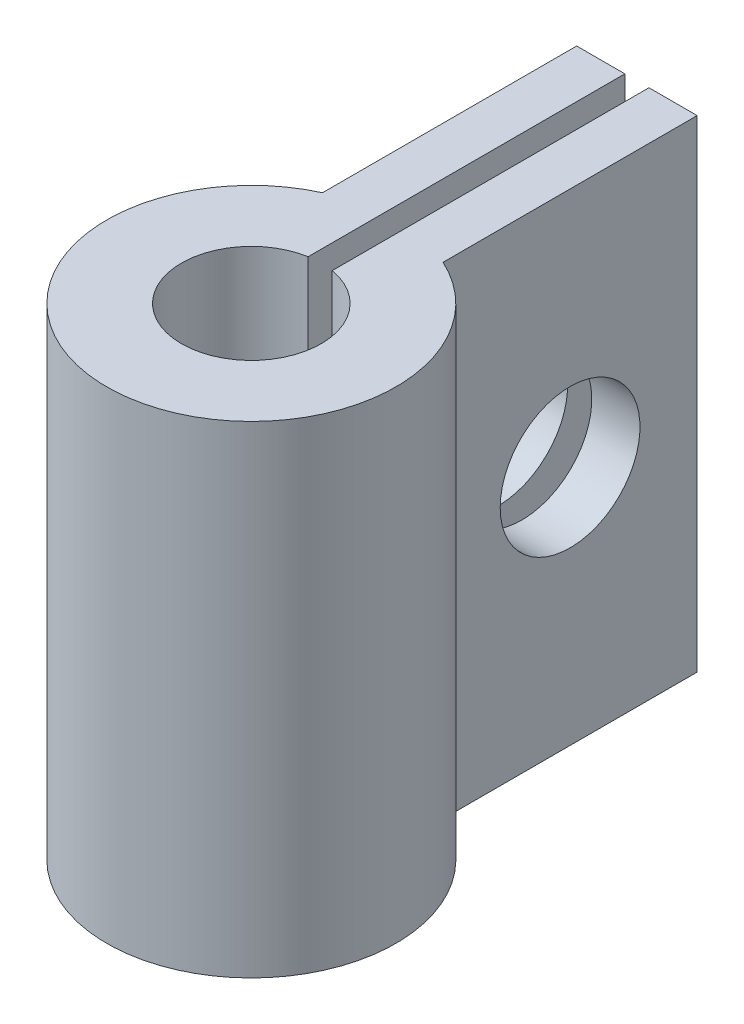
ISO-10303-21;
HEADER;
FILE_DESCRIPTION(('STEP AP214'),'2;1');
FILE_NAME('part.step','',(''),(''),'','','');
FILE_SCHEMA(('AUTOMOTIVE_DESIGN { 1 0 10303 214 1 1 1 1 }'));
ENDSEC;
DATA;
#1=APPLICATION_CONTEXT('core data for automotive mechanical design processes');
#2=APPLICATION_PROTOCOL_DEFINITION('international standard','automotive_design',2000,#1);
#3=PRODUCT_CONTEXT('',#1,'mechanical');
#4=PRODUCT('Part','Part','',(#3));
#5=PRODUCT_RELATED_PRODUCT_CATEGORY('part','',(#4));
#6=PRODUCT_DEFINITION_FORMATION('','',#4);
#7=PRODUCT_DEFINITION_CONTEXT('part definition',#1,'design');
#8=PRODUCT_DEFINITION('design','',#6,#7);
#9=PRODUCT_DEFINITION_SHAPE('','',#8);
#10=(LENGTH_UNIT() NAMED_UNIT(*) SI_UNIT(.MILLI.,.METRE.));
#11=(NAMED_UNIT(*) PLANE_ANGLE_UNIT() SI_UNIT($,.RADIAN.));
#12=(NAMED_UNIT(*) SI_UNIT($,.STERADIAN.) SOLID_ANGLE_UNIT());
#13=UNCERTAINTY_MEASURE_WITH_UNIT(LENGTH_MEASURE(1.E-05),#10,'distance_accuracy_value','');
#14=(GEOMETRIC_REPRESENTATION_CONTEXT(3) GLOBAL_UNCERTAINTY_ASSIGNED_CONTEXT((#13)) GLOBAL_UNIT_ASSIGNED_CONTEXT((#10,
#11,#12)) REPRESENTATION_CONTEXT('',''));
#15=CARTESIAN_POINT('',(0.,0.,0.));
#16=DIRECTION('',(0.,0.,1.));
#17=DIRECTION('',(1.,0.,0.));
#18=AXIS2_PLACEMENT_3D('',#15,#16,#17);
#19=CARTESIAN_POINT('',(0.,20.,0.));
#20=DIRECTION('',(0.,-1.,0.));
#21=DIRECTION('',(0.,0.,-1.));
#22=AXIS2_PLACEMENT_3D('',#19,#20,#21);
#23=CYLINDRICAL_SURFACE('',#22,6.);
#24=DIRECTION('',(0.,-1.,0.));
#25=VECTOR('',#24,1.);
#26=CARTESIAN_POINT('',(2.5,20.,-5.45435605731786));
#27=LINE('',#26,#25);
#28=CARTESIAN_POINT('',(2.5,20.,-5.45435605731786));
#29=VERTEX_POINT('',#28);
#30=CARTESIAN_POINT('',(2.5,0.,-5.45435605731786));
#31=VERTEX_POINT('',#30);
#32=EDGE_CURVE('E131',#29,#31,#27,.T.);
#33=ORIENTED_EDGE('',*,*,#32,.F.);
#34=CARTESIAN_POINT('',(0.,20.,0.));
#35=DIRECTION('',(0.,1.,0.));
#36=DIRECTION('',(0.,0.,1.));
#37=AXIS2_PLACEMENT_3D('',#34,#35,#36);
#38=CIRCLE('',#37,6.);
#39=CARTESIAN_POINT('',(-2.5,20.,-5.45435605731786));
#40=VERTEX_POINT('',#39);
#41=EDGE_CURVE('E11',#40,#29,#38,.T.);
#42=ORIENTED_EDGE('',*,*,#41,.F.);
#43=DIRECTION('',(0.,-1.,0.));
#44=VECTOR('',#43,1.);
#45=CARTESIAN_POINT('',(-2.5,20.,-5.45435605731786));
#46=LINE('',#45,#44);
#47=CARTESIAN_POINT('',(-2.5,0.,-5.45435605731786));
#48=VERTEX_POINT('',#47);
#49=EDGE_CURVE('E120',#40,#48,#46,.T.);
#50=ORIENTED_EDGE('',*,*,#49,.T.);
#51=CARTESIAN_POINT('',(0.,0.,0.));
#52=DIRECTION('',(0.,1.,0.));
#53=DIRECTION('',(0.,0.,1.));
#54=AXIS2_PLACEMENT_3D('',#51,#52,#53);
#55=CIRCLE('',#54,6.);
#56=EDGE_CURVE('E41',#48,#31,#55,.T.);
#57=ORIENTED_EDGE('',*,*,#56,.T.);
#58=EDGE_LOOP('',(#33,#42,#50,#57));
#59=FACE_BOUND('',#58,.T.);
#60=ADVANCED_FACE('F33',(#59),#23,.T.);
#61=CARTESIAN_POINT('',(0.,20.,0.));
#62=DIRECTION('',(0.,1.,0.));
#63=DIRECTION('',(0.,0.,1.));
#64=AXIS2_PLACEMENT_3D('',#61,#62,#63);
#65=PLANE('',#64);
#66=DIRECTION('',(0.,0.,1.));
#67=VECTOR('',#66,1.);
#68=CARTESIAN_POINT('',(0.5,20.,-4.211348031276));
#69=LINE('',#68,#67);
#70=CARTESIAN_POINT('',(0.5,20.,-16.));
#71=VERTEX_POINT('',#70);
#72=CARTESIAN_POINT('',(0.5,20.,-2.85657137141714));
#73=VERTEX_POINT('',#72);
#74=EDGE_CURVE('E101',#71,#73,#69,.T.);
#75=ORIENTED_EDGE('',*,*,#74,.T.);
#76=CARTESIAN_POINT('',(0.,20.,0.));
#77=DIRECTION('',(0.,1.,0.));
#78=DIRECTION('',(0.,0.,1.));
#79=AXIS2_PLACEMENT_3D('',#76,#77,#78);
#80=CIRCLE('',#79,2.9);
#81=CARTESIAN_POINT('',(-0.5,20.,-2.85657137141714));
#82=VERTEX_POINT('',#81);
#83=EDGE_CURVE('E104',#82,#73,#80,.T.);
#84=ORIENTED_EDGE('',*,*,#83,.F.);
#85=DIRECTION('',(0.,0.,1.));
#86=VECTOR('',#85,1.);
#87=CARTESIAN_POINT('',(-0.5,20.,-4.54515351113991));
#88=LINE('',#87,#86);
#89=CARTESIAN_POINT('',(-0.5,20.,-16.));
#90=VERTEX_POINT('',#89);
#91=EDGE_CURVE('E57',#90,#82,#88,.T.);
#92=ORIENTED_EDGE('',*,*,#91,.F.);
#93=DIRECTION('',(-1.,0.,0.));
#94=VECTOR('',#93,1.);
#95=CARTESIAN_POINT('',(-0.5,20.,-16.));
#96=LINE('',#95,#94);
#97=CARTESIAN_POINT('',(-2.5,20.,-16.));
#98=VERTEX_POINT('',#97);
#99=EDGE_CURVE('E163',#90,#98,#96,.T.);
#100=ORIENTED_EDGE('',*,*,#99,.T.);
#101=DIRECTION('',(0.,0.,1.));
#102=VECTOR('',#101,1.);
#103=CARTESIAN_POINT('',(-2.5,20.,-6.));
#104=LINE('',#103,#102);
#105=EDGE_CURVE('E159',#98,#40,#104,.T.);
#106=ORIENTED_EDGE('',*,*,#105,.T.);
#107=ORIENTED_EDGE('',*,*,#41,.T.);
#108=DIRECTION('',(0.,0.,1.));
#109=VECTOR('',#108,1.);
#110=CARTESIAN_POINT('',(2.5,20.,-6.));
#111=LINE('',#110,#109);
#112=CARTESIAN_POINT('',(2.5,20.,-16.));
#113=VERTEX_POINT('',#112);
#114=EDGE_CURVE('E108',#113,#29,#111,.T.);
#115=ORIENTED_EDGE('',*,*,#114,.F.);
#116=DIRECTION('',(1.,0.,0.));
#117=VECTOR('',#116,1.);
#118=CARTESIAN_POINT('',(0.5,20.,-16.));
#119=LINE('',#118,#117);
#120=EDGE_CURVE('E106',#71,#113,#119,.T.);
#121=ORIENTED_EDGE('',*,*,#120,.F.);
#122=EDGE_LOOP('',(#75,#84,#92,#100,#106,#107,#115,#121));
#123=FACE_BOUND('',#122,.T.);
#124=ADVANCED_FACE('F102',(#123),#65,.T.);
#125=CARTESIAN_POINT('',(0.,0.,0.));
#126=DIRECTION('',(0.,1.,0.));
#127=DIRECTION('',(0.,0.,1.));
#128=AXIS2_PLACEMENT_3D('',#125,#126,#127);
#129=PLANE('',#128);
#130=CARTESIAN_POINT('',(0.,0.,0.));
#131=DIRECTION('',(0.,1.,0.));
#132=DIRECTION('',(0.,0.,1.));
#133=AXIS2_PLACEMENT_3D('',#130,#131,#132);
#134=CIRCLE('',#133,2.9);
#135=CARTESIAN_POINT('',(-0.5,0.,-2.85657137141714));
#136=VERTEX_POINT('',#135);
#137=CARTESIAN_POINT('',(0.5,0.,-2.85657137141714));
#138=VERTEX_POINT('',#137);
#139=EDGE_CURVE('E119',#136,#138,#134,.T.);
#140=ORIENTED_EDGE('',*,*,#139,.T.);
#141=DIRECTION('',(0.,0.,-1.));
#142=VECTOR('',#141,1.);
#143=CARTESIAN_POINT('',(0.5,0.,-6.));
#144=LINE('',#143,#142);
#145=CARTESIAN_POINT('',(0.5,0.,-16.));
#146=VERTEX_POINT('',#145);
#147=EDGE_CURVE('E49',#138,#146,#144,.T.);
#148=ORIENTED_EDGE('',*,*,#147,.T.);
#149=DIRECTION('',(1.,0.,0.));
#150=VECTOR('',#149,1.);
#151=CARTESIAN_POINT('',(0.5,0.,-16.));
#152=LINE('',#151,#150);
#153=CARTESIAN_POINT('',(2.5,0.,-16.));
#154=VERTEX_POINT('',#153);
#155=EDGE_CURVE('E144',#146,#154,#152,.T.);
#156=ORIENTED_EDGE('',*,*,#155,.T.);
#157=DIRECTION('',(0.,0.,-1.));
#158=VECTOR('',#157,1.);
#159=CARTESIAN_POINT('',(2.5,0.,-16.));
#160=LINE('',#159,#158);
#161=EDGE_CURVE('E138',#31,#154,#160,.T.);
#162=ORIENTED_EDGE('',*,*,#161,.F.);
#163=ORIENTED_EDGE('',*,*,#56,.F.);
#164=DIRECTION('',(0.,0.,-1.));
#165=VECTOR('',#164,1.);
#166=CARTESIAN_POINT('',(-2.5,0.,-16.));
#167=LINE('',#166,#165);
#168=CARTESIAN_POINT('',(-2.5,0.,-16.));
#169=VERTEX_POINT('',#168);
#170=EDGE_CURVE('E140',#48,#169,#167,.T.);
#171=ORIENTED_EDGE('',*,*,#170,.T.);
#172=DIRECTION('',(-1.,0.,0.));
#173=VECTOR('',#172,1.);
#174=CARTESIAN_POINT('',(-0.5,0.,-16.));
#175=LINE('',#174,#173);
#176=CARTESIAN_POINT('',(-0.5,0.,-16.));
#177=VERTEX_POINT('',#176);
#178=EDGE_CURVE('E123',#177,#169,#175,.T.);
#179=ORIENTED_EDGE('',*,*,#178,.F.);
#180=DIRECTION('',(0.,0.,-1.));
#181=VECTOR('',#180,1.);
#182=CARTESIAN_POINT('',(-0.5,0.,-6.));
#183=LINE('',#182,#181);
#184=EDGE_CURVE('E158',#136,#177,#183,.T.);
#185=ORIENTED_EDGE('',*,*,#184,.F.);
#186=EDGE_LOOP('',(#140,#148,#156,#162,#163,#171,#179,#185));
#187=FACE_BOUND('',#186,.T.);
#188=ADVANCED_FACE('F142',(#187),#129,.F.);
#189=CARTESIAN_POINT('',(0.,-5.99999999999999,0.));
#190=DIRECTION('',(0.,1.,0.));
#191=DIRECTION('',(0.,0.,1.));
#192=AXIS2_PLACEMENT_3D('',#189,#190,#191);
#193=CYLINDRICAL_SURFACE('',#192,2.9);
#194=ORIENTED_EDGE('',*,*,#83,.T.);
#195=DIRECTION('',(0.,1.,0.));
#196=VECTOR('',#195,1.);
#197=CARTESIAN_POINT('',(0.5,-5.99999999999999,-2.85657137141714));
#198=LINE('',#197,#196);
#199=EDGE_CURVE('E110',#73,#138,#198,.F.);
#200=ORIENTED_EDGE('',*,*,#199,.T.);
#201=ORIENTED_EDGE('',*,*,#139,.F.);
#202=DIRECTION('',(0.,1.,0.));
#203=VECTOR('',#202,1.);
#204=CARTESIAN_POINT('',(-0.5,-5.99999999999999,-2.85657137141714));
#205=LINE('',#204,#203);
#206=EDGE_CURVE('E115',#136,#82,#205,.T.);
#207=ORIENTED_EDGE('',*,*,#206,.T.);
#208=EDGE_LOOP('',(#194,#200,#201,#207));
#209=FACE_BOUND('',#208,.T.);
#210=ADVANCED_FACE('F118',(#209),#193,.F.);
#211=CARTESIAN_POINT('',(-0.5,0.,0.));
#212=DIRECTION('',(-1.,0.,0.));
#213=DIRECTION('',(0.,0.,1.));
#214=AXIS2_PLACEMENT_3D('',#211,#212,#213);
#215=PLANE('',#214);
#216=CARTESIAN_POINT('',(-0.5,10.,-10.7271780286589));
#217=DIRECTION('',(-1.,0.,0.));
#218=DIRECTION('',(0.,0.,1.));
#219=AXIS2_PLACEMENT_3D('',#216,#217,#218);
#220=CIRCLE('',#219,2.9);
#221=CARTESIAN_POINT('',(-0.5,10.,-7.82717802865893));
#222=VERTEX_POINT('',#221);
#223=EDGE_CURVE('E116',#222,#222,#220,.T.);
#224=ORIENTED_EDGE('',*,*,#223,.T.);
#225=EDGE_LOOP('',(#224));
#226=FACE_BOUND('',#225,.T.);
#227=ORIENTED_EDGE('',*,*,#91,.T.);
#228=ORIENTED_EDGE('',*,*,#206,.F.);
#229=ORIENTED_EDGE('',*,*,#184,.T.);
#230=DIRECTION('',(0.,1.,0.));
#231=VECTOR('',#230,1.);
#232=CARTESIAN_POINT('',(-0.5,20.,-16.));
#233=LINE('',#232,#231);
#234=EDGE_CURVE('E161',#177,#90,#233,.T.);
#235=ORIENTED_EDGE('',*,*,#234,.T.);
#236=EDGE_LOOP('',(#227,#228,#229,#235));
#237=FACE_BOUND('',#236,.T.);
#238=ADVANCED_FACE('F180',(#226,#237),#215,.F.);
#239=CARTESIAN_POINT('',(-2.5,0.,0.));
#240=DIRECTION('',(-1.,0.,0.));
#241=DIRECTION('',(0.,0.,1.));
#242=AXIS2_PLACEMENT_3D('',#239,#240,#241);
#243=PLANE('',#242);
#244=CARTESIAN_POINT('',(-2.5,10.,-10.7271780286589));
#245=DIRECTION('',(-1.,0.,0.));
#246=DIRECTION('',(0.,0.,1.));
#247=AXIS2_PLACEMENT_3D('',#244,#245,#246);
#248=CIRCLE('',#247,2.9);
#249=CARTESIAN_POINT('',(-2.5,10.,-7.82717802865893));
#250=VERTEX_POINT('',#249);
#251=EDGE_CURVE('E223',#250,#250,#248,.T.);
#252=ORIENTED_EDGE('',*,*,#251,.F.);
#253=EDGE_LOOP('',(#252));
#254=FACE_BOUND('',#253,.T.);
#255=ORIENTED_EDGE('',*,*,#49,.F.);
#256=ORIENTED_EDGE('',*,*,#105,.F.);
#257=DIRECTION('',(0.,1.,0.));
#258=VECTOR('',#257,1.);
#259=CARTESIAN_POINT('',(-2.5,20.,-16.));
#260=LINE('',#259,#258);
#261=EDGE_CURVE('E165',#169,#98,#260,.T.);
#262=ORIENTED_EDGE('',*,*,#261,.F.);
#263=ORIENTED_EDGE('',*,*,#170,.F.);
#264=EDGE_LOOP('',(#255,#256,#262,#263));
#265=FACE_BOUND('',#264,.T.);
#266=ADVANCED_FACE('F179',(#254,#265),#243,.T.);
#267=CARTESIAN_POINT('',(-0.5,20.,-16.));
#268=DIRECTION('',(0.,0.,1.));
#269=DIRECTION('',(0.,-1.,0.));
#270=AXIS2_PLACEMENT_3D('',#267,#268,#269);
#271=PLANE('',#270);
#272=ORIENTED_EDGE('',*,*,#261,.T.);
#273=ORIENTED_EDGE('',*,*,#99,.F.);
#274=ORIENTED_EDGE('',*,*,#234,.F.);
#275=ORIENTED_EDGE('',*,*,#178,.T.);
#276=EDGE_LOOP('',(#272,#273,#274,#275));
#277=FACE_BOUND('',#276,.T.);
#278=ADVANCED_FACE('F175',(#277),#271,.F.);
#279=CARTESIAN_POINT('',(0.5,0.,0.));
#280=DIRECTION('',(-1.,0.,0.));
#281=DIRECTION('',(0.,0.,1.));
#282=AXIS2_PLACEMENT_3D('',#279,#280,#281);
#283=PLANE('',#282);
#284=CARTESIAN_POINT('',(0.5,10.,-10.7271780286589));
#285=DIRECTION('',(-1.,0.,0.));
#286=DIRECTION('',(0.,0.,1.));
#287=AXIS2_PLACEMENT_3D('',#284,#285,#286);
#288=CIRCLE('',#287,2.9);
#289=CARTESIAN_POINT('',(0.5,10.,-7.82717802865893));
#290=VERTEX_POINT('',#289);
#291=EDGE_CURVE('E218',#290,#290,#288,.T.);
#292=ORIENTED_EDGE('',*,*,#291,.F.);
#293=EDGE_LOOP('',(#292));
#294=FACE_BOUND('',#293,.T.);
#295=ORIENTED_EDGE('',*,*,#147,.F.);
#296=ORIENTED_EDGE('',*,*,#199,.F.);
#297=ORIENTED_EDGE('',*,*,#74,.F.);
#298=DIRECTION('',(0.,1.,0.));
#299=VECTOR('',#298,1.);
#300=CARTESIAN_POINT('',(0.5,20.,-16.));
#301=LINE('',#300,#299);
#302=EDGE_CURVE('E151',#146,#71,#301,.T.);
#303=ORIENTED_EDGE('',*,*,#302,.F.);
#304=EDGE_LOOP('',(#295,#296,#297,#303));
#305=FACE_BOUND('',#304,.T.);
#306=ADVANCED_FACE('F111',(#294,#305),#283,.T.);
#307=CARTESIAN_POINT('',(2.5,0.,0.));
#308=DIRECTION('',(-1.,0.,0.));
#309=DIRECTION('',(0.,0.,1.));
#310=AXIS2_PLACEMENT_3D('',#307,#308,#309);
#311=PLANE('',#310);
#312=CARTESIAN_POINT('',(2.5,10.,-10.7271780286589));
#313=DIRECTION('',(-1.,0.,0.));
#314=DIRECTION('',(0.,0.,1.));
#315=AXIS2_PLACEMENT_3D('',#312,#313,#314);
#316=CIRCLE('',#315,2.9);
#317=CARTESIAN_POINT('',(2.5,10.,-7.82717802865893));
#318=VERTEX_POINT('',#317);
#319=EDGE_CURVE('E36',#318,#318,#316,.T.);
#320=ORIENTED_EDGE('',*,*,#319,.T.);
#321=EDGE_LOOP('',(#320));
#322=FACE_BOUND('',#321,.T.);
#323=ORIENTED_EDGE('',*,*,#114,.T.);
#324=ORIENTED_EDGE('',*,*,#32,.T.);
#325=ORIENTED_EDGE('',*,*,#161,.T.);
#326=DIRECTION('',(0.,1.,0.));
#327=VECTOR('',#326,1.);
#328=CARTESIAN_POINT('',(2.5,20.,-16.));
#329=LINE('',#328,#327);
#330=EDGE_CURVE('E146',#154,#113,#329,.T.);
#331=ORIENTED_EDGE('',*,*,#330,.T.);
#332=EDGE_LOOP('',(#323,#324,#325,#331));
#333=FACE_BOUND('',#332,.T.);
#334=ADVANCED_FACE('F136',(#322,#333),#311,.F.);
#335=CARTESIAN_POINT('',(0.5,20.,-16.));
#336=DIRECTION('',(0.,0.,-1.));
#337=DIRECTION('',(0.,1.,0.));
#338=AXIS2_PLACEMENT_3D('',#335,#336,#337);
#339=PLANE('',#338);
#340=ORIENTED_EDGE('',*,*,#330,.F.);
#341=ORIENTED_EDGE('',*,*,#155,.F.);
#342=ORIENTED_EDGE('',*,*,#302,.T.);
#343=ORIENTED_EDGE('',*,*,#120,.T.);
#344=EDGE_LOOP('',(#340,#341,#342,#343));
#345=FACE_BOUND('',#344,.T.);
#346=ADVANCED_FACE('F182',(#345),#339,.T.);
#347=CARTESIAN_POINT('',(14.5,10.,-10.7271780286589));
#348=DIRECTION('',(-1.,0.,0.));
#349=DIRECTION('',(0.,0.,1.));
#350=AXIS2_PLACEMENT_3D('',#347,#348,#349);
#351=CYLINDRICAL_SURFACE('',#350,2.9);
#352=ORIENTED_EDGE('',*,*,#291,.T.);
#353=EDGE_LOOP('',(#352));
#354=FACE_BOUND('',#353,.T.);
#355=ORIENTED_EDGE('',*,*,#319,.F.);
#356=EDGE_LOOP('',(#355));
#357=FACE_BOUND('',#356,.T.);
#358=ADVANCED_FACE('F184',(#354,#357),#351,.F.);
#359=ORIENTED_EDGE('',*,*,#251,.T.);
#360=EDGE_LOOP('',(#359));
#361=FACE_BOUND('',#360,.T.);
#362=ORIENTED_EDGE('',*,*,#223,.F.);
#363=EDGE_LOOP('',(#362));
#364=FACE_BOUND('',#363,.T.);
#365=ADVANCED_FACE('F190',(#361,#364),#351,.F.);
#366=CLOSED_SHELL('',(#60,#124,#188,#210,#238,#266,#278,#306,#334,#346,#358,#365));
#367=MANIFOLD_SOLID_BREP('B2',#366);
#368=ADVANCED_BREP_SHAPE_REPRESENTATION('',(#18,#367),#14);
#369=SHAPE_DEFINITION_REPRESENTATION(#9,#368);
ENDSEC;
END-ISO-10303-21;
